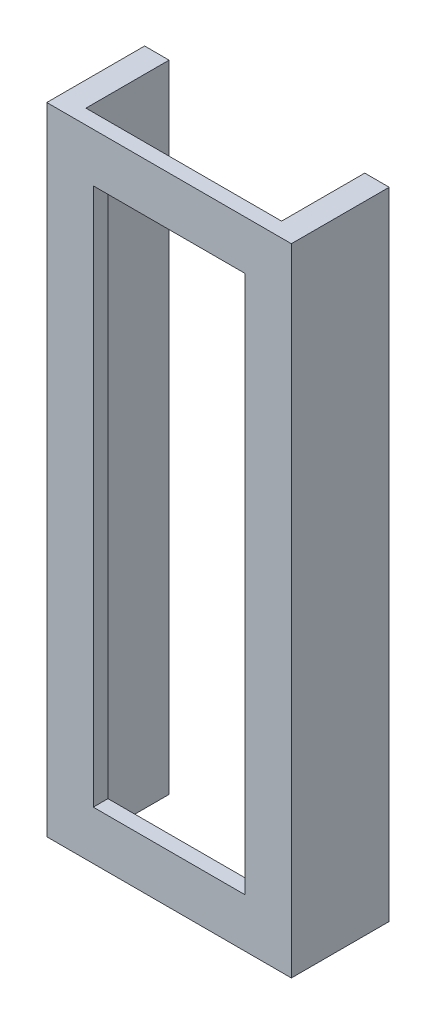
ISO-10303-21;
HEADER;
FILE_DESCRIPTION(('STEP AP214'),'2;1');
FILE_NAME('part.step','',(''),(''),'','','');
FILE_SCHEMA(('AUTOMOTIVE_DESIGN { 1 0 10303 214 1 1 1 1 }'));
ENDSEC;
DATA;
#1=APPLICATION_CONTEXT('core data for automotive mechanical design processes');
#2=APPLICATION_PROTOCOL_DEFINITION('international standard','automotive_design',2000,#1);
#3=PRODUCT_CONTEXT('',#1,'mechanical');
#4=PRODUCT('Part','Part','',(#3));
#5=PRODUCT_RELATED_PRODUCT_CATEGORY('part','',(#4));
#6=PRODUCT_DEFINITION_FORMATION('','',#4);
#7=PRODUCT_DEFINITION_CONTEXT('part definition',#1,'design');
#8=PRODUCT_DEFINITION('design','',#6,#7);
#9=PRODUCT_DEFINITION_SHAPE('','',#8);
#10=(LENGTH_UNIT() NAMED_UNIT(*) SI_UNIT(.MILLI.,.METRE.));
#11=(NAMED_UNIT(*) PLANE_ANGLE_UNIT() SI_UNIT($,.RADIAN.));
#12=(NAMED_UNIT(*) SI_UNIT($,.STERADIAN.) SOLID_ANGLE_UNIT());
#13=UNCERTAINTY_MEASURE_WITH_UNIT(LENGTH_MEASURE(1.E-05),#10,'distance_accuracy_value','');
#14=(GEOMETRIC_REPRESENTATION_CONTEXT(3) GLOBAL_UNCERTAINTY_ASSIGNED_CONTEXT((#13)) GLOBAL_UNIT_ASSIGNED_CONTEXT((#10,
#11,#12)) REPRESENTATION_CONTEXT('',''));
#15=CARTESIAN_POINT('',(0.,0.,0.));
#16=DIRECTION('',(0.,0.,1.));
#17=DIRECTION('',(1.,0.,0.));
#18=AXIS2_PLACEMENT_3D('',#15,#16,#17);
#19=CARTESIAN_POINT('',(10.,30.,1.5));
#20=DIRECTION('',(0.,0.,1.));
#21=DIRECTION('',(1.,0.,0.));
#22=AXIS2_PLACEMENT_3D('',#19,#20,#21);
#23=PLANE('',#22);
#24=DIRECTION('',(1.,0.,0.));
#25=VECTOR('',#24,1.);
#26=CARTESIAN_POINT('',(2.25,57.5,1.5));
#27=LINE('',#26,#25);
#28=CARTESIAN_POINT('',(2.25,57.5,1.5));
#29=VERTEX_POINT('',#28);
#30=CARTESIAN_POINT('',(17.75,57.5,1.5));
#31=VERTEX_POINT('',#30);
#32=EDGE_CURVE('E141',#29,#31,#27,.T.);
#33=ORIENTED_EDGE('',*,*,#32,.T.);
#34=DIRECTION('',(0.,-1.,0.));
#35=VECTOR('',#34,1.);
#36=CARTESIAN_POINT('',(17.75,57.5,1.5));
#37=LINE('',#36,#35);
#38=CARTESIAN_POINT('',(17.75,2.5,1.5));
#39=VERTEX_POINT('',#38);
#40=EDGE_CURVE('E190',#31,#39,#37,.T.);
#41=ORIENTED_EDGE('',*,*,#40,.T.);
#42=DIRECTION('',(-1.,0.,0.));
#43=VECTOR('',#42,1.);
#44=CARTESIAN_POINT('',(17.75,2.5,1.5));
#45=LINE('',#44,#43);
#46=CARTESIAN_POINT('',(2.25,2.5,1.5));
#47=VERTEX_POINT('',#46);
#48=EDGE_CURVE('E181',#39,#47,#45,.T.);
#49=ORIENTED_EDGE('',*,*,#48,.T.);
#50=DIRECTION('',(0.,1.,0.));
#51=VECTOR('',#50,1.);
#52=CARTESIAN_POINT('',(2.25,2.5,1.5));
#53=LINE('',#52,#51);
#54=EDGE_CURVE('E171',#47,#29,#53,.T.);
#55=ORIENTED_EDGE('',*,*,#54,.T.);
#56=EDGE_LOOP('',(#33,#41,#49,#55));
#57=FACE_BOUND('',#56,.T.);
#58=DIRECTION('',(0.,1.,0.));
#59=VECTOR('',#58,1.);
#60=CARTESIAN_POINT('',(22.5,-2.5,1.5));
#61=LINE('',#60,#59);
#62=CARTESIAN_POINT('',(22.5,-2.5,1.5));
#63=VERTEX_POINT('',#62);
#64=CARTESIAN_POINT('',(22.5,62.5,1.5));
#65=VERTEX_POINT('',#64);
#66=EDGE_CURVE('E11',#63,#65,#61,.T.);
#67=ORIENTED_EDGE('',*,*,#66,.T.);
#68=DIRECTION('',(-1.,0.,0.));
#69=VECTOR('',#68,1.);
#70=CARTESIAN_POINT('',(22.5,62.5,1.5));
#71=LINE('',#70,#69);
#72=CARTESIAN_POINT('',(-2.5,62.5,1.5));
#73=VERTEX_POINT('',#72);
#74=EDGE_CURVE('E45',#65,#73,#71,.T.);
#75=ORIENTED_EDGE('',*,*,#74,.T.);
#76=DIRECTION('',(0.,-1.,0.));
#77=VECTOR('',#76,1.);
#78=CARTESIAN_POINT('',(-2.5,62.5,1.5));
#79=LINE('',#78,#77);
#80=CARTESIAN_POINT('',(-2.5,-2.5,1.5));
#81=VERTEX_POINT('',#80);
#82=EDGE_CURVE('E198',#73,#81,#79,.T.);
#83=ORIENTED_EDGE('',*,*,#82,.T.);
#84=DIRECTION('',(1.,0.,0.));
#85=VECTOR('',#84,1.);
#86=CARTESIAN_POINT('',(-2.5,-2.5,1.5));
#87=LINE('',#86,#85);
#88=EDGE_CURVE('E142',#81,#63,#87,.T.);
#89=ORIENTED_EDGE('',*,*,#88,.T.);
#90=EDGE_LOOP('',(#67,#75,#83,#89));
#91=FACE_BOUND('',#90,.T.);
#92=ADVANCED_FACE('F16',(#57,#91),#23,.T.);
#93=CARTESIAN_POINT('',(22.5,-2.5,0.));
#94=DIRECTION('',(1.,0.,0.));
#95=DIRECTION('',(0.,-1.,0.));
#96=AXIS2_PLACEMENT_3D('',#93,#94,#95);
#97=PLANE('',#96);
#98=DIRECTION('',(0.,0.,1.));
#99=VECTOR('',#98,1.);
#100=CARTESIAN_POINT('',(22.5,62.5,0.));
#101=LINE('',#100,#99);
#102=CARTESIAN_POINT('',(22.5,62.5,-8.5));
#103=VERTEX_POINT('',#102);
#104=EDGE_CURVE('E25',#103,#65,#101,.T.);
#105=ORIENTED_EDGE('',*,*,#104,.T.);
#106=ORIENTED_EDGE('',*,*,#66,.F.);
#107=DIRECTION('',(0.,0.,-1.));
#108=VECTOR('',#107,1.);
#109=CARTESIAN_POINT('',(22.5,-2.5,0.));
#110=LINE('',#109,#108);
#111=CARTESIAN_POINT('',(22.5,-2.5,-8.5));
#112=VERTEX_POINT('',#111);
#113=EDGE_CURVE('E132',#63,#112,#110,.T.);
#114=ORIENTED_EDGE('',*,*,#113,.T.);
#115=DIRECTION('',(0.,-1.,0.));
#116=VECTOR('',#115,1.);
#117=CARTESIAN_POINT('',(22.5,-2.5,-8.5));
#118=LINE('',#117,#116);
#119=EDGE_CURVE('E140',#103,#112,#118,.T.);
#120=ORIENTED_EDGE('',*,*,#119,.F.);
#121=EDGE_LOOP('',(#105,#106,#114,#120));
#122=FACE_BOUND('',#121,.T.);
#123=ADVANCED_FACE('F134',(#122),#97,.T.);
#124=CARTESIAN_POINT('',(22.5,62.5,0.));
#125=DIRECTION('',(0.,1.,0.));
#126=DIRECTION('',(1.,0.,0.));
#127=AXIS2_PLACEMENT_3D('',#124,#125,#126);
#128=PLANE('',#127);
#129=DIRECTION('',(-1.,0.,0.));
#130=VECTOR('',#129,1.);
#131=CARTESIAN_POINT('',(22.5,62.5,0.));
#132=LINE('',#131,#130);
#133=CARTESIAN_POINT('',(20.,62.5,0.));
#134=VERTEX_POINT('',#133);
#135=CARTESIAN_POINT('',(0.,62.5,0.));
#136=VERTEX_POINT('',#135);
#137=EDGE_CURVE('E250',#134,#136,#132,.T.);
#138=ORIENTED_EDGE('',*,*,#137,.T.);
#139=DIRECTION('',(0.,0.,-1.));
#140=VECTOR('',#139,1.);
#141=CARTESIAN_POINT('',(0.,62.5,0.));
#142=LINE('',#141,#140);
#143=CARTESIAN_POINT('',(0.,62.5,-8.5));
#144=VERTEX_POINT('',#143);
#145=EDGE_CURVE('E231',#136,#144,#142,.T.);
#146=ORIENTED_EDGE('',*,*,#145,.T.);
#147=DIRECTION('',(1.,0.,0.));
#148=VECTOR('',#147,1.);
#149=CARTESIAN_POINT('',(22.5,62.5,-8.5));
#150=LINE('',#149,#148);
#151=CARTESIAN_POINT('',(-2.5,62.5,-8.5));
#152=VERTEX_POINT('',#151);
#153=EDGE_CURVE('E211',#152,#144,#150,.T.);
#154=ORIENTED_EDGE('',*,*,#153,.F.);
#155=DIRECTION('',(0.,0.,1.));
#156=VECTOR('',#155,1.);
#157=CARTESIAN_POINT('',(-2.5,62.5,0.));
#158=LINE('',#157,#156);
#159=EDGE_CURVE('E200',#152,#73,#158,.T.);
#160=ORIENTED_EDGE('',*,*,#159,.T.);
#161=ORIENTED_EDGE('',*,*,#74,.F.);
#162=ORIENTED_EDGE('',*,*,#104,.F.);
#163=DIRECTION('',(1.,0.,0.));
#164=VECTOR('',#163,1.);
#165=CARTESIAN_POINT('',(22.5,62.5,-8.5));
#166=LINE('',#165,#164);
#167=CARTESIAN_POINT('',(20.,62.5,-8.5));
#168=VERTEX_POINT('',#167);
#169=EDGE_CURVE('E160',#168,#103,#166,.T.);
#170=ORIENTED_EDGE('',*,*,#169,.F.);
#171=DIRECTION('',(0.,0.,-1.));
#172=VECTOR('',#171,1.);
#173=CARTESIAN_POINT('',(20.,62.5,0.));
#174=LINE('',#173,#172);
#175=EDGE_CURVE('E265',#134,#168,#174,.T.);
#176=ORIENTED_EDGE('',*,*,#175,.F.);
#177=EDGE_LOOP('',(#138,#146,#154,#160,#161,#162,#170,#176));
#178=FACE_BOUND('',#177,.T.);
#179=ADVANCED_FACE('F210',(#178),#128,.T.);
#180=CARTESIAN_POINT('',(-2.5,62.5,0.));
#181=DIRECTION('',(-1.,0.,0.));
#182=DIRECTION('',(0.,0.,1.));
#183=AXIS2_PLACEMENT_3D('',#180,#181,#182);
#184=PLANE('',#183);
#185=DIRECTION('',(0.,0.,1.));
#186=VECTOR('',#185,1.);
#187=CARTESIAN_POINT('',(-2.5,-2.5,0.));
#188=LINE('',#187,#186);
#189=CARTESIAN_POINT('',(-2.5,-2.5,-8.5));
#190=VERTEX_POINT('',#189);
#191=EDGE_CURVE('E194',#190,#81,#188,.T.);
#192=ORIENTED_EDGE('',*,*,#191,.T.);
#193=ORIENTED_EDGE('',*,*,#82,.F.);
#194=ORIENTED_EDGE('',*,*,#159,.F.);
#195=DIRECTION('',(0.,1.,0.));
#196=VECTOR('',#195,1.);
#197=CARTESIAN_POINT('',(-2.5,62.5,-8.5));
#198=LINE('',#197,#196);
#199=EDGE_CURVE('E225',#190,#152,#198,.T.);
#200=ORIENTED_EDGE('',*,*,#199,.F.);
#201=EDGE_LOOP('',(#192,#193,#194,#200));
#202=FACE_BOUND('',#201,.T.);
#203=ADVANCED_FACE('F18',(#202),#184,.T.);
#204=CARTESIAN_POINT('',(-2.5,-2.5,0.));
#205=DIRECTION('',(0.,-1.,0.));
#206=DIRECTION('',(0.,0.,-1.));
#207=AXIS2_PLACEMENT_3D('',#204,#205,#206);
#208=PLANE('',#207);
#209=DIRECTION('',(1.,0.,0.));
#210=VECTOR('',#209,1.);
#211=CARTESIAN_POINT('',(-2.5,-2.5,0.));
#212=LINE('',#211,#210);
#213=CARTESIAN_POINT('',(0.,-2.5,0.));
#214=VERTEX_POINT('',#213);
#215=CARTESIAN_POINT('',(20.,-2.5,0.));
#216=VERTEX_POINT('',#215);
#217=EDGE_CURVE('E238',#214,#216,#212,.T.);
#218=ORIENTED_EDGE('',*,*,#217,.T.);
#219=DIRECTION('',(0.,0.,-1.));
#220=VECTOR('',#219,1.);
#221=CARTESIAN_POINT('',(20.,-2.5,0.));
#222=LINE('',#221,#220);
#223=CARTESIAN_POINT('',(20.,-2.5,-8.5));
#224=VERTEX_POINT('',#223);
#225=EDGE_CURVE('E149',#216,#224,#222,.T.);
#226=ORIENTED_EDGE('',*,*,#225,.T.);
#227=DIRECTION('',(-1.,0.,0.));
#228=VECTOR('',#227,1.);
#229=CARTESIAN_POINT('',(-2.5,-2.5,-8.5));
#230=LINE('',#229,#228);
#231=EDGE_CURVE('E148',#112,#224,#230,.T.);
#232=ORIENTED_EDGE('',*,*,#231,.F.);
#233=ORIENTED_EDGE('',*,*,#113,.F.);
#234=ORIENTED_EDGE('',*,*,#88,.F.);
#235=ORIENTED_EDGE('',*,*,#191,.F.);
#236=DIRECTION('',(-1.,0.,0.));
#237=VECTOR('',#236,1.);
#238=CARTESIAN_POINT('',(-2.5,-2.5,-8.5));
#239=LINE('',#238,#237);
#240=CARTESIAN_POINT('',(0.,-2.5,-8.5));
#241=VERTEX_POINT('',#240);
#242=EDGE_CURVE('E217',#241,#190,#239,.T.);
#243=ORIENTED_EDGE('',*,*,#242,.F.);
#244=DIRECTION('',(0.,0.,-1.));
#245=VECTOR('',#244,1.);
#246=CARTESIAN_POINT('',(0.,-2.5,0.));
#247=LINE('',#246,#245);
#248=EDGE_CURVE('E324',#214,#241,#247,.T.);
#249=ORIENTED_EDGE('',*,*,#248,.F.);
#250=EDGE_LOOP('',(#218,#226,#232,#233,#234,#235,#243,#249));
#251=FACE_BOUND('',#250,.T.);
#252=ADVANCED_FACE('F146',(#251),#208,.T.);
#253=CARTESIAN_POINT('',(2.25,57.5,0.));
#254=DIRECTION('',(0.,-1.,0.));
#255=DIRECTION('',(0.,0.,-1.));
#256=AXIS2_PLACEMENT_3D('',#253,#254,#255);
#257=PLANE('',#256);
#258=DIRECTION('',(1.,0.,0.));
#259=VECTOR('',#258,1.);
#260=CARTESIAN_POINT('',(2.25,57.5,0.));
#261=LINE('',#260,#259);
#262=CARTESIAN_POINT('',(2.25,57.5,0.));
#263=VERTEX_POINT('',#262);
#264=CARTESIAN_POINT('',(17.75,57.5,0.));
#265=VERTEX_POINT('',#264);
#266=EDGE_CURVE('E239',#263,#265,#261,.T.);
#267=ORIENTED_EDGE('',*,*,#266,.T.);
#268=DIRECTION('',(0.,0.,1.));
#269=VECTOR('',#268,1.);
#270=CARTESIAN_POINT('',(17.75,57.5,0.));
#271=LINE('',#270,#269);
#272=EDGE_CURVE('E178',#265,#31,#271,.T.);
#273=ORIENTED_EDGE('',*,*,#272,.T.);
#274=ORIENTED_EDGE('',*,*,#32,.F.);
#275=DIRECTION('',(0.,0.,1.));
#276=VECTOR('',#275,1.);
#277=CARTESIAN_POINT('',(2.25,57.5,0.));
#278=LINE('',#277,#276);
#279=EDGE_CURVE('E152',#263,#29,#278,.T.);
#280=ORIENTED_EDGE('',*,*,#279,.F.);
#281=EDGE_LOOP('',(#267,#273,#274,#280));
#282=FACE_BOUND('',#281,.T.);
#283=ADVANCED_FACE('F384',(#282),#257,.T.);
#284=CARTESIAN_POINT('',(17.75,57.5,0.));
#285=DIRECTION('',(-1.,0.,0.));
#286=DIRECTION('',(0.,0.,1.));
#287=AXIS2_PLACEMENT_3D('',#284,#285,#286);
#288=PLANE('',#287);
#289=DIRECTION('',(0.,-1.,0.));
#290=VECTOR('',#289,1.);
#291=CARTESIAN_POINT('',(17.75,57.5,0.));
#292=LINE('',#291,#290);
#293=CARTESIAN_POINT('',(17.75,2.5,0.));
#294=VERTEX_POINT('',#293);
#295=EDGE_CURVE('E256',#265,#294,#292,.T.);
#296=ORIENTED_EDGE('',*,*,#295,.T.);
#297=DIRECTION('',(0.,0.,1.));
#298=VECTOR('',#297,1.);
#299=CARTESIAN_POINT('',(17.75,2.5,0.));
#300=LINE('',#299,#298);
#301=EDGE_CURVE('E183',#294,#39,#300,.T.);
#302=ORIENTED_EDGE('',*,*,#301,.T.);
#303=ORIENTED_EDGE('',*,*,#40,.F.);
#304=ORIENTED_EDGE('',*,*,#272,.F.);
#305=EDGE_LOOP('',(#296,#302,#303,#304));
#306=FACE_BOUND('',#305,.T.);
#307=ADVANCED_FACE('F385',(#306),#288,.T.);
#308=CARTESIAN_POINT('',(17.75,2.5,0.));
#309=DIRECTION('',(0.,1.,0.));
#310=DIRECTION('',(1.,0.,0.));
#311=AXIS2_PLACEMENT_3D('',#308,#309,#310);
#312=PLANE('',#311);
#313=DIRECTION('',(-1.,0.,0.));
#314=VECTOR('',#313,1.);
#315=CARTESIAN_POINT('',(17.75,2.5,0.));
#316=LINE('',#315,#314);
#317=CARTESIAN_POINT('',(2.25,2.5,0.));
#318=VERTEX_POINT('',#317);
#319=EDGE_CURVE('E254',#294,#318,#316,.T.);
#320=ORIENTED_EDGE('',*,*,#319,.T.);
#321=DIRECTION('',(0.,0.,1.));
#322=VECTOR('',#321,1.);
#323=CARTESIAN_POINT('',(2.25,2.5,0.));
#324=LINE('',#323,#322);
#325=EDGE_CURVE('E175',#318,#47,#324,.T.);
#326=ORIENTED_EDGE('',*,*,#325,.T.);
#327=ORIENTED_EDGE('',*,*,#48,.F.);
#328=ORIENTED_EDGE('',*,*,#301,.F.);
#329=EDGE_LOOP('',(#320,#326,#327,#328));
#330=FACE_BOUND('',#329,.T.);
#331=ADVANCED_FACE('F377',(#330),#312,.T.);
#332=CARTESIAN_POINT('',(2.25,2.5,0.));
#333=DIRECTION('',(1.,0.,0.));
#334=DIRECTION('',(0.,1.,0.));
#335=AXIS2_PLACEMENT_3D('',#332,#333,#334);
#336=PLANE('',#335);
#337=DIRECTION('',(0.,1.,0.));
#338=VECTOR('',#337,1.);
#339=CARTESIAN_POINT('',(2.25,2.5,0.));
#340=LINE('',#339,#338);
#341=EDGE_CURVE('E243',#318,#263,#340,.T.);
#342=ORIENTED_EDGE('',*,*,#341,.T.);
#343=ORIENTED_EDGE('',*,*,#279,.T.);
#344=ORIENTED_EDGE('',*,*,#54,.F.);
#345=ORIENTED_EDGE('',*,*,#325,.F.);
#346=EDGE_LOOP('',(#342,#343,#344,#345));
#347=FACE_BOUND('',#346,.T.);
#348=ADVANCED_FACE('F368',(#347),#336,.T.);
#349=CARTESIAN_POINT('',(21.25,30.,-8.5));
#350=DIRECTION('',(0.,0.,-1.));
#351=DIRECTION('',(0.,-1.,0.));
#352=AXIS2_PLACEMENT_3D('',#349,#350,#351);
#353=PLANE('',#352);
#354=DIRECTION('',(0.,1.,0.));
#355=VECTOR('',#354,1.);
#356=CARTESIAN_POINT('',(20.,0.,-8.5));
#357=LINE('',#356,#355);
#358=EDGE_CURVE('E264',#224,#168,#357,.T.);
#359=ORIENTED_EDGE('',*,*,#358,.T.);
#360=ORIENTED_EDGE('',*,*,#169,.T.);
#361=ORIENTED_EDGE('',*,*,#119,.T.);
#362=ORIENTED_EDGE('',*,*,#231,.T.);
#363=EDGE_LOOP('',(#359,#360,#361,#362));
#364=FACE_BOUND('',#363,.T.);
#365=ADVANCED_FACE('F156',(#364),#353,.T.);
#366=CARTESIAN_POINT('',(20.,-2.5,0.));
#367=DIRECTION('',(-1.,0.,0.));
#368=DIRECTION('',(0.,0.,1.));
#369=AXIS2_PLACEMENT_3D('',#366,#367,#368);
#370=PLANE('',#369);
#371=DIRECTION('',(0.,-1.,0.));
#372=VECTOR('',#371,1.);
#373=CARTESIAN_POINT('',(20.,13.75,0.));
#374=LINE('',#373,#372);
#375=EDGE_CURVE('E248',#134,#216,#374,.T.);
#376=ORIENTED_EDGE('',*,*,#375,.F.);
#377=ORIENTED_EDGE('',*,*,#175,.T.);
#378=ORIENTED_EDGE('',*,*,#358,.F.);
#379=ORIENTED_EDGE('',*,*,#225,.F.);
#380=EDGE_LOOP('',(#376,#377,#378,#379));
#381=FACE_BOUND('',#380,.T.);
#382=ADVANCED_FACE('F356',(#381),#370,.T.);
#383=CARTESIAN_POINT('',(10.,30.,0.));
#384=DIRECTION('',(0.,0.,1.));
#385=DIRECTION('',(1.,0.,0.));
#386=AXIS2_PLACEMENT_3D('',#383,#384,#385);
#387=PLANE('',#386);
#388=ORIENTED_EDGE('',*,*,#266,.F.);
#389=ORIENTED_EDGE('',*,*,#341,.F.);
#390=ORIENTED_EDGE('',*,*,#319,.F.);
#391=ORIENTED_EDGE('',*,*,#295,.F.);
#392=EDGE_LOOP('',(#388,#389,#390,#391));
#393=FACE_BOUND('',#392,.T.);
#394=DIRECTION('',(0.,1.,0.));
#395=VECTOR('',#394,1.);
#396=CARTESIAN_POINT('',(0.,46.25,0.));
#397=LINE('',#396,#395);
#398=EDGE_CURVE('E338',#214,#136,#397,.T.);
#399=ORIENTED_EDGE('',*,*,#398,.T.);
#400=ORIENTED_EDGE('',*,*,#137,.F.);
#401=ORIENTED_EDGE('',*,*,#375,.T.);
#402=ORIENTED_EDGE('',*,*,#217,.F.);
#403=EDGE_LOOP('',(#399,#400,#401,#402));
#404=FACE_BOUND('',#403,.T.);
#405=ADVANCED_FACE('F349',(#393,#404),#387,.F.);
#406=CARTESIAN_POINT('',(-1.25,30.,-8.5));
#407=DIRECTION('',(0.,0.,-1.));
#408=DIRECTION('',(0.,-1.,0.));
#409=AXIS2_PLACEMENT_3D('',#406,#407,#408);
#410=PLANE('',#409);
#411=DIRECTION('',(0.,-1.,0.));
#412=VECTOR('',#411,1.);
#413=CARTESIAN_POINT('',(0.,0.,-8.5));
#414=LINE('',#413,#412);
#415=EDGE_CURVE('E229',#144,#241,#414,.T.);
#416=ORIENTED_EDGE('',*,*,#415,.T.);
#417=ORIENTED_EDGE('',*,*,#242,.T.);
#418=ORIENTED_EDGE('',*,*,#199,.T.);
#419=ORIENTED_EDGE('',*,*,#153,.T.);
#420=EDGE_LOOP('',(#416,#417,#418,#419));
#421=FACE_BOUND('',#420,.T.);
#422=ADVANCED_FACE('F226',(#421),#410,.T.);
#423=CARTESIAN_POINT('',(0.,62.5,0.));
#424=DIRECTION('',(1.,0.,0.));
#425=DIRECTION('',(0.,1.,0.));
#426=AXIS2_PLACEMENT_3D('',#423,#424,#425);
#427=PLANE('',#426);
#428=ORIENTED_EDGE('',*,*,#398,.F.);
#429=ORIENTED_EDGE('',*,*,#248,.T.);
#430=ORIENTED_EDGE('',*,*,#415,.F.);
#431=ORIENTED_EDGE('',*,*,#145,.F.);
#432=EDGE_LOOP('',(#428,#429,#430,#431));
#433=FACE_BOUND('',#432,.T.);
#434=ADVANCED_FACE('F352',(#433),#427,.T.);
#435=CLOSED_SHELL('',(#92,#123,#179,#203,#252,#283,#307,#331,#348,#365,#382,#405,#422,#434));
#436=MANIFOLD_SOLID_BREP('B1',#435);
#437=ADVANCED_BREP_SHAPE_REPRESENTATION('',(#18,#436),#14);
#438=SHAPE_DEFINITION_REPRESENTATION(#9,#437);
ENDSEC;
END-ISO-10303-21;
